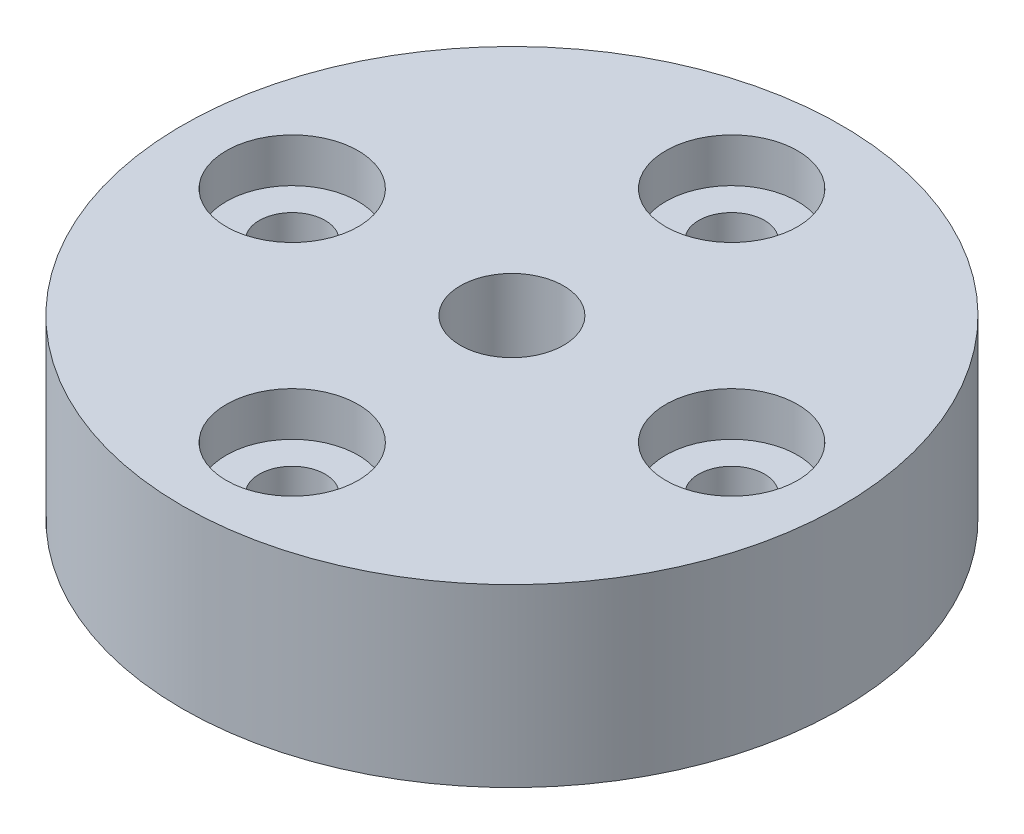
ISO-10303-21;
HEADER;
FILE_DESCRIPTION(('STEP AP214'),'2;1');
FILE_NAME('part.step','',(''),(''),'','','');
FILE_SCHEMA(('AUTOMOTIVE_DESIGN { 1 0 10303 214 1 1 1 1 }'));
ENDSEC;
DATA;
#1=APPLICATION_CONTEXT('core data for automotive mechanical design processes');
#2=APPLICATION_PROTOCOL_DEFINITION('international standard','automotive_design',2000,#1);
#3=PRODUCT_CONTEXT('',#1,'mechanical');
#4=PRODUCT('Part','Part','',(#3));
#5=PRODUCT_RELATED_PRODUCT_CATEGORY('part','',(#4));
#6=PRODUCT_DEFINITION_FORMATION('','',#4);
#7=PRODUCT_DEFINITION_CONTEXT('part definition',#1,'design');
#8=PRODUCT_DEFINITION('design','',#6,#7);
#9=PRODUCT_DEFINITION_SHAPE('','',#8);
#10=(LENGTH_UNIT() NAMED_UNIT(*) SI_UNIT(.MILLI.,.METRE.));
#11=(NAMED_UNIT(*) PLANE_ANGLE_UNIT() SI_UNIT($,.RADIAN.));
#12=(NAMED_UNIT(*) SI_UNIT($,.STERADIAN.) SOLID_ANGLE_UNIT());
#13=UNCERTAINTY_MEASURE_WITH_UNIT(LENGTH_MEASURE(1.E-05),#10,'distance_accuracy_value','');
#14=(GEOMETRIC_REPRESENTATION_CONTEXT(3) GLOBAL_UNCERTAINTY_ASSIGNED_CONTEXT((#13)) GLOBAL_UNIT_ASSIGNED_CONTEXT((#10,
#11,#12)) REPRESENTATION_CONTEXT('',''));
#15=CARTESIAN_POINT('',(0.,0.,0.));
#16=DIRECTION('',(0.,0.,1.));
#17=DIRECTION('',(1.,0.,0.));
#18=AXIS2_PLACEMENT_3D('',#15,#16,#17);
#19=CARTESIAN_POINT('',(5.64760248210638E-13,8.,10.));
#20=DIRECTION('',(0.,-1.,0.));
#21=DIRECTION('',(0.,0.,-1.));
#22=AXIS2_PLACEMENT_3D('',#19,#20,#21);
#23=CYLINDRICAL_SURFACE('',#22,1.50000000000061);
#24=CARTESIAN_POINT('',(5.64760248210638E-13,6.,10.));
#25=DIRECTION('',(0.,1.,0.));
#26=DIRECTION('',(0.,0.,1.));
#27=AXIS2_PLACEMENT_3D('',#24,#25,#26);
#28=CIRCLE('',#27,1.50000000000061);
#29=CARTESIAN_POINT('',(5.64760248210638E-13,6.,11.5000000000006));
#30=VERTEX_POINT('',#29);
#31=EDGE_CURVE('E186',#30,#30,#28,.F.);
#32=ORIENTED_EDGE('',*,*,#31,.F.);
#33=EDGE_LOOP('',(#32));
#34=FACE_BOUND('',#33,.T.);
#35=CARTESIAN_POINT('',(5.64760248210638E-13,2.,10.));
#36=DIRECTION('',(0.,-1.,0.));
#37=DIRECTION('',(0.,0.,-1.));
#38=AXIS2_PLACEMENT_3D('',#35,#36,#37);
#39=CIRCLE('',#38,1.50000000000061);
#40=CARTESIAN_POINT('',(5.64760248210638E-13,2.,8.49999999999939));
#41=VERTEX_POINT('',#40);
#42=EDGE_CURVE('E45',#41,#41,#39,.T.);
#43=ORIENTED_EDGE('',*,*,#42,.T.);
#44=EDGE_LOOP('',(#43));
#45=FACE_BOUND('',#44,.T.);
#46=ADVANCED_FACE('F41',(#34,#45),#23,.F.);
#47=CARTESIAN_POINT('',(10.0000000000003,8.,-2.82380124105319E-13));
#48=DIRECTION('',(0.,-1.,0.));
#49=DIRECTION('',(0.,0.,-1.));
#50=AXIS2_PLACEMENT_3D('',#47,#48,#49);
#51=CYLINDRICAL_SURFACE('',#50,1.50000000000022);
#52=CARTESIAN_POINT('',(10.0000000000003,6.,-2.82380124105319E-13));
#53=DIRECTION('',(0.,1.,0.));
#54=DIRECTION('',(0.,0.,1.));
#55=AXIS2_PLACEMENT_3D('',#52,#53,#54);
#56=CIRCLE('',#55,1.50000000000022);
#57=CARTESIAN_POINT('',(10.0000000000003,6.,1.49999999999994));
#58=VERTEX_POINT('',#57);
#59=EDGE_CURVE('E198',#58,#58,#56,.F.);
#60=ORIENTED_EDGE('',*,*,#59,.F.);
#61=EDGE_LOOP('',(#60));
#62=FACE_BOUND('',#61,.T.);
#63=CARTESIAN_POINT('',(10.0000000000003,2.,-2.82380124105319E-13));
#64=DIRECTION('',(0.,-1.,0.));
#65=DIRECTION('',(0.,0.,-1.));
#66=AXIS2_PLACEMENT_3D('',#63,#64,#65);
#67=CIRCLE('',#66,1.50000000000022);
#68=CARTESIAN_POINT('',(10.0000000000003,2.,-1.5000000000005));
#69=VERTEX_POINT('',#68);
#70=EDGE_CURVE('E75',#69,#69,#67,.T.);
#71=ORIENTED_EDGE('',*,*,#70,.T.);
#72=EDGE_LOOP('',(#71));
#73=FACE_BOUND('',#72,.T.);
#74=ADVANCED_FACE('F124',(#62,#73),#51,.F.);
#75=CARTESIAN_POINT('',(0.,8.,-10.));
#76=DIRECTION('',(0.,-1.,0.));
#77=DIRECTION('',(0.,0.,-1.));
#78=AXIS2_PLACEMENT_3D('',#75,#76,#77);
#79=CYLINDRICAL_SURFACE('',#78,1.5);
#80=CARTESIAN_POINT('',(0.,6.,-10.));
#81=DIRECTION('',(0.,1.,0.));
#82=DIRECTION('',(0.,0.,1.));
#83=AXIS2_PLACEMENT_3D('',#80,#81,#82);
#84=CIRCLE('',#83,1.5);
#85=CARTESIAN_POINT('',(0.,6.,-8.5));
#86=VERTEX_POINT('',#85);
#87=EDGE_CURVE('E62',#86,#86,#84,.T.);
#88=ORIENTED_EDGE('',*,*,#87,.T.);
#89=EDGE_LOOP('',(#88));
#90=FACE_BOUND('',#89,.T.);
#91=CARTESIAN_POINT('',(0.,2.,-10.));
#92=DIRECTION('',(0.,-1.,0.));
#93=DIRECTION('',(0.,0.,-1.));
#94=AXIS2_PLACEMENT_3D('',#91,#92,#93);
#95=CIRCLE('',#94,1.5);
#96=CARTESIAN_POINT('',(0.,2.,-11.5));
#97=VERTEX_POINT('',#96);
#98=EDGE_CURVE('E71',#97,#97,#95,.T.);
#99=ORIENTED_EDGE('',*,*,#98,.T.);
#100=EDGE_LOOP('',(#99));
#101=FACE_BOUND('',#100,.T.);
#102=ADVANCED_FACE('F130',(#90,#101),#79,.F.);
#103=CARTESIAN_POINT('',(-9.99999999999972,8.,2.83604770904466E-13));
#104=DIRECTION('',(0.,-1.,0.));
#105=DIRECTION('',(0.,0.,-1.));
#106=AXIS2_PLACEMENT_3D('',#103,#104,#105);
#107=CYLINDRICAL_SURFACE('',#106,1.50000000000045);
#108=CARTESIAN_POINT('',(-9.99999999999972,6.,2.83604770904466E-13));
#109=DIRECTION('',(0.,1.,0.));
#110=DIRECTION('',(0.,0.,1.));
#111=AXIS2_PLACEMENT_3D('',#108,#109,#110);
#112=CIRCLE('',#111,1.50000000000045);
#113=CARTESIAN_POINT('',(-9.99999999999972,6.,1.50000000000074));
#114=VERTEX_POINT('',#113);
#115=EDGE_CURVE('E171',#114,#114,#112,.F.);
#116=ORIENTED_EDGE('',*,*,#115,.F.);
#117=EDGE_LOOP('',(#116));
#118=FACE_BOUND('',#117,.T.);
#119=CARTESIAN_POINT('',(-9.99999999999972,2.,2.83604770904466E-13));
#120=DIRECTION('',(0.,-1.,0.));
#121=DIRECTION('',(0.,0.,-1.));
#122=AXIS2_PLACEMENT_3D('',#119,#120,#121);
#123=CIRCLE('',#122,1.50000000000045);
#124=CARTESIAN_POINT('',(-9.99999999999972,2.,-1.50000000000017));
#125=VERTEX_POINT('',#124);
#126=EDGE_CURVE('E67',#125,#125,#123,.T.);
#127=ORIENTED_EDGE('',*,*,#126,.T.);
#128=EDGE_LOOP('',(#127));
#129=FACE_BOUND('',#128,.T.);
#130=ADVANCED_FACE('F43',(#118,#129),#107,.F.);
#131=CARTESIAN_POINT('',(0.,8.,0.));
#132=DIRECTION('',(0.,-1.,0.));
#133=DIRECTION('',(0.,0.,-1.));
#134=AXIS2_PLACEMENT_3D('',#131,#132,#133);
#135=CYLINDRICAL_SURFACE('',#134,15.);
#136=CARTESIAN_POINT('',(0.,8.,0.));
#137=DIRECTION('',(0.,1.,0.));
#138=DIRECTION('',(0.,0.,1.));
#139=AXIS2_PLACEMENT_3D('',#136,#137,#138);
#140=CIRCLE('',#139,15.);
#141=CARTESIAN_POINT('',(0.,8.,15.));
#142=VERTEX_POINT('',#141);
#143=EDGE_CURVE('E10',#142,#142,#140,.T.);
#144=ORIENTED_EDGE('',*,*,#143,.F.);
#145=EDGE_LOOP('',(#144));
#146=FACE_BOUND('',#145,.T.);
#147=CARTESIAN_POINT('',(0.,0.,0.));
#148=DIRECTION('',(0.,1.,0.));
#149=DIRECTION('',(0.,0.,1.));
#150=AXIS2_PLACEMENT_3D('',#147,#148,#149);
#151=CIRCLE('',#150,15.);
#152=CARTESIAN_POINT('',(0.,0.,15.));
#153=VERTEX_POINT('',#152);
#154=EDGE_CURVE('E50',#153,#153,#151,.T.);
#155=ORIENTED_EDGE('',*,*,#154,.T.);
#156=EDGE_LOOP('',(#155));
#157=FACE_BOUND('',#156,.T.);
#158=ADVANCED_FACE('F109',(#146,#157),#135,.T.);
#159=CARTESIAN_POINT('',(0.,8.,0.));
#160=DIRECTION('',(0.,1.,0.));
#161=DIRECTION('',(0.,0.,1.));
#162=AXIS2_PLACEMENT_3D('',#159,#160,#161);
#163=PLANE('',#162);
#164=CARTESIAN_POINT('',(-9.99999999999972,8.,2.83604770904466E-13));
#165=DIRECTION('',(0.,1.,0.));
#166=DIRECTION('',(0.,0.,1.));
#167=AXIS2_PLACEMENT_3D('',#164,#165,#166);
#168=CIRCLE('',#167,3.00000000000045);
#169=CARTESIAN_POINT('',(-9.99999999999972,8.,3.00000000000074));
#170=VERTEX_POINT('',#169);
#171=EDGE_CURVE('E175',#170,#170,#168,.T.);
#172=ORIENTED_EDGE('',*,*,#171,.F.);
#173=EDGE_LOOP('',(#172));
#174=FACE_BOUND('',#173,.T.);
#175=CARTESIAN_POINT('',(5.64760248210638E-13,8.,10.));
#176=DIRECTION('',(0.,1.,0.));
#177=DIRECTION('',(0.,0.,1.));
#178=AXIS2_PLACEMENT_3D('',#175,#176,#177);
#179=CIRCLE('',#178,3.00000000000061);
#180=CARTESIAN_POINT('',(5.64760248210638E-13,8.,13.0000000000006));
#181=VERTEX_POINT('',#180);
#182=EDGE_CURVE('E182',#181,#181,#179,.T.);
#183=ORIENTED_EDGE('',*,*,#182,.F.);
#184=EDGE_LOOP('',(#183));
#185=FACE_BOUND('',#184,.T.);
#186=CARTESIAN_POINT('',(10.0000000000003,8.,-2.82380124105319E-13));
#187=DIRECTION('',(0.,1.,0.));
#188=DIRECTION('',(0.,0.,1.));
#189=AXIS2_PLACEMENT_3D('',#186,#187,#188);
#190=CIRCLE('',#189,3.00000000000022);
#191=CARTESIAN_POINT('',(10.0000000000003,8.,2.99999999999994));
#192=VERTEX_POINT('',#191);
#193=EDGE_CURVE('E191',#192,#192,#190,.T.);
#194=ORIENTED_EDGE('',*,*,#193,.F.);
#195=EDGE_LOOP('',(#194));
#196=FACE_BOUND('',#195,.T.);
#197=CARTESIAN_POINT('',(0.,8.,-10.));
#198=DIRECTION('',(0.,1.,0.));
#199=DIRECTION('',(0.,0.,1.));
#200=AXIS2_PLACEMENT_3D('',#197,#198,#199);
#201=CIRCLE('',#200,3.);
#202=CARTESIAN_POINT('',(0.,8.,-7.));
#203=VERTEX_POINT('',#202);
#204=EDGE_CURVE('E87',#203,#203,#201,.T.);
#205=ORIENTED_EDGE('',*,*,#204,.F.);
#206=EDGE_LOOP('',(#205));
#207=FACE_BOUND('',#206,.T.);
#208=CARTESIAN_POINT('',(0.,8.,0.));
#209=DIRECTION('',(0.,1.,0.));
#210=DIRECTION('',(0.,0.,1.));
#211=AXIS2_PLACEMENT_3D('',#208,#209,#210);
#212=CIRCLE('',#211,2.35);
#213=CARTESIAN_POINT('',(0.,8.,2.35));
#214=VERTEX_POINT('',#213);
#215=EDGE_CURVE('E59',#214,#214,#212,.T.);
#216=ORIENTED_EDGE('',*,*,#215,.F.);
#217=EDGE_LOOP('',(#216));
#218=FACE_BOUND('',#217,.T.);
#219=ORIENTED_EDGE('',*,*,#143,.T.);
#220=EDGE_LOOP('',(#219));
#221=FACE_BOUND('',#220,.T.);
#222=ADVANCED_FACE('F106',(#174,#185,#196,#207,#218,#221),#163,.T.);
#223=CARTESIAN_POINT('',(0.,0.,0.));
#224=DIRECTION('',(0.,1.,0.));
#225=DIRECTION('',(0.,0.,1.));
#226=AXIS2_PLACEMENT_3D('',#223,#224,#225);
#227=PLANE('',#226);
#228=CARTESIAN_POINT('',(5.64760248210638E-13,0.,10.));
#229=DIRECTION('',(0.,-1.,0.));
#230=DIRECTION('',(0.,0.,-1.));
#231=AXIS2_PLACEMENT_3D('',#228,#229,#230);
#232=CIRCLE('',#231,3.);
#233=CARTESIAN_POINT('',(5.64760248210638E-13,0.,7.));
#234=VERTEX_POINT('',#233);
#235=EDGE_CURVE('E279',#234,#234,#232,.T.);
#236=ORIENTED_EDGE('',*,*,#235,.F.);
#237=EDGE_LOOP('',(#236));
#238=FACE_BOUND('',#237,.T.);
#239=CARTESIAN_POINT('',(10.0000000000003,0.,-2.86054064502761E-13));
#240=DIRECTION('',(0.,-1.,0.));
#241=DIRECTION('',(0.,0.,-1.));
#242=AXIS2_PLACEMENT_3D('',#239,#240,#241);
#243=CIRCLE('',#242,3.00000000000022);
#244=CARTESIAN_POINT('',(10.0000000000003,0.,-3.0000000000005));
#245=VERTEX_POINT('',#244);
#246=EDGE_CURVE('E283',#245,#245,#243,.T.);
#247=ORIENTED_EDGE('',*,*,#246,.F.);
#248=EDGE_LOOP('',(#247));
#249=FACE_BOUND('',#248,.T.);
#250=CARTESIAN_POINT('',(0.,0.,-10.));
#251=DIRECTION('',(0.,-1.,0.));
#252=DIRECTION('',(0.,0.,-1.));
#253=AXIS2_PLACEMENT_3D('',#250,#251,#252);
#254=CIRCLE('',#253,3.0000000000006);
#255=CARTESIAN_POINT('',(0.,0.,-13.0000000000006));
#256=VERTEX_POINT('',#255);
#257=EDGE_CURVE('E155',#256,#256,#254,.T.);
#258=ORIENTED_EDGE('',*,*,#257,.F.);
#259=EDGE_LOOP('',(#258));
#260=FACE_BOUND('',#259,.T.);
#261=CARTESIAN_POINT('',(-9.99999999999972,0.,2.84829417703614E-13));
#262=DIRECTION('',(0.,-1.,0.));
#263=DIRECTION('',(0.,0.,-1.));
#264=AXIS2_PLACEMENT_3D('',#261,#262,#263);
#265=CIRCLE('',#264,3.00000000000045);
#266=CARTESIAN_POINT('',(-9.99999999999972,0.,-3.00000000000016));
#267=VERTEX_POINT('',#266);
#268=EDGE_CURVE('E156',#267,#267,#265,.T.);
#269=ORIENTED_EDGE('',*,*,#268,.F.);
#270=EDGE_LOOP('',(#269));
#271=FACE_BOUND('',#270,.T.);
#272=CARTESIAN_POINT('',(0.,0.,0.));
#273=DIRECTION('',(0.,1.,0.));
#274=DIRECTION('',(0.,0.,1.));
#275=AXIS2_PLACEMENT_3D('',#272,#273,#274);
#276=CIRCLE('',#275,2.35);
#277=CARTESIAN_POINT('',(0.,0.,2.35));
#278=VERTEX_POINT('',#277);
#279=EDGE_CURVE('E56',#278,#278,#276,.T.);
#280=ORIENTED_EDGE('',*,*,#279,.T.);
#281=EDGE_LOOP('',(#280));
#282=FACE_BOUND('',#281,.T.);
#283=ORIENTED_EDGE('',*,*,#154,.F.);
#284=EDGE_LOOP('',(#283));
#285=FACE_BOUND('',#284,.T.);
#286=ADVANCED_FACE('F108',(#238,#249,#260,#271,#282,#285),#227,.F.);
#287=CARTESIAN_POINT('',(0.,0.,0.));
#288=DIRECTION('',(0.,1.,0.));
#289=DIRECTION('',(0.,0.,1.));
#290=AXIS2_PLACEMENT_3D('',#287,#288,#289);
#291=CYLINDRICAL_SURFACE('',#290,2.35);
#292=ORIENTED_EDGE('',*,*,#279,.F.);
#293=EDGE_LOOP('',(#292));
#294=FACE_BOUND('',#293,.T.);
#295=ORIENTED_EDGE('',*,*,#215,.T.);
#296=EDGE_LOOP('',(#295));
#297=FACE_BOUND('',#296,.T.);
#298=ADVANCED_FACE('F104',(#294,#297),#291,.F.);
#299=CARTESIAN_POINT('',(0.,6.,-10.));
#300=DIRECTION('',(0.,1.,0.));
#301=DIRECTION('',(0.,0.,1.));
#302=AXIS2_PLACEMENT_3D('',#299,#300,#301);
#303=CYLINDRICAL_SURFACE('',#302,3.);
#304=CARTESIAN_POINT('',(0.,6.,-10.));
#305=DIRECTION('',(0.,1.,0.));
#306=DIRECTION('',(0.,0.,1.));
#307=AXIS2_PLACEMENT_3D('',#304,#305,#306);
#308=CIRCLE('',#307,3.);
#309=CARTESIAN_POINT('',(0.,6.,-7.));
#310=VERTEX_POINT('',#309);
#311=EDGE_CURVE('E82',#310,#310,#308,.T.);
#312=ORIENTED_EDGE('',*,*,#311,.F.);
#313=EDGE_LOOP('',(#312));
#314=FACE_BOUND('',#313,.T.);
#315=ORIENTED_EDGE('',*,*,#204,.T.);
#316=EDGE_LOOP('',(#315));
#317=FACE_BOUND('',#316,.T.);
#318=ADVANCED_FACE('F222',(#314,#317),#303,.F.);
#319=CARTESIAN_POINT('',(0.,6.,-10.));
#320=DIRECTION('',(0.,1.,0.));
#321=DIRECTION('',(0.,0.,1.));
#322=AXIS2_PLACEMENT_3D('',#319,#320,#321);
#323=PLANE('',#322);
#324=ORIENTED_EDGE('',*,*,#87,.F.);
#325=EDGE_LOOP('',(#324));
#326=FACE_BOUND('',#325,.T.);
#327=ORIENTED_EDGE('',*,*,#311,.T.);
#328=EDGE_LOOP('',(#327));
#329=FACE_BOUND('',#328,.T.);
#330=ADVANCED_FACE('F215',(#326,#329),#323,.T.);
#331=CARTESIAN_POINT('',(10.0000000000003,6.,-2.82380124105319E-13));
#332=DIRECTION('',(0.,1.,0.));
#333=DIRECTION('',(0.,0.,1.));
#334=AXIS2_PLACEMENT_3D('',#331,#332,#333);
#335=CYLINDRICAL_SURFACE('',#334,3.00000000000022);
#336=CARTESIAN_POINT('',(10.0000000000003,6.,-2.82380124105319E-13));
#337=DIRECTION('',(0.,1.,0.));
#338=DIRECTION('',(0.,0.,1.));
#339=AXIS2_PLACEMENT_3D('',#336,#337,#338);
#340=CIRCLE('',#339,3.00000000000022);
#341=CARTESIAN_POINT('',(10.0000000000003,6.,2.99999999999994));
#342=VERTEX_POINT('',#341);
#343=EDGE_CURVE('E93',#342,#342,#340,.T.);
#344=ORIENTED_EDGE('',*,*,#343,.F.);
#345=EDGE_LOOP('',(#344));
#346=FACE_BOUND('',#345,.T.);
#347=ORIENTED_EDGE('',*,*,#193,.T.);
#348=EDGE_LOOP('',(#347));
#349=FACE_BOUND('',#348,.T.);
#350=ADVANCED_FACE('F209',(#346,#349),#335,.F.);
#351=CARTESIAN_POINT('',(0.,6.,0.));
#352=DIRECTION('',(0.,1.,0.));
#353=DIRECTION('',(0.,0.,1.));
#354=AXIS2_PLACEMENT_3D('',#351,#352,#353);
#355=PLANE('',#354);
#356=ORIENTED_EDGE('',*,*,#59,.T.);
#357=EDGE_LOOP('',(#356));
#358=FACE_BOUND('',#357,.T.);
#359=ORIENTED_EDGE('',*,*,#343,.T.);
#360=EDGE_LOOP('',(#359));
#361=FACE_BOUND('',#360,.T.);
#362=ADVANCED_FACE('F205',(#358,#361),#355,.T.);
#363=CARTESIAN_POINT('',(5.64760248210638E-13,6.,10.));
#364=DIRECTION('',(0.,1.,0.));
#365=DIRECTION('',(0.,0.,1.));
#366=AXIS2_PLACEMENT_3D('',#363,#364,#365);
#367=CYLINDRICAL_SURFACE('',#366,3.00000000000061);
#368=CARTESIAN_POINT('',(5.64760248210638E-13,6.,10.));
#369=DIRECTION('',(0.,1.,0.));
#370=DIRECTION('',(0.,0.,1.));
#371=AXIS2_PLACEMENT_3D('',#368,#369,#370);
#372=CIRCLE('',#371,3.00000000000061);
#373=CARTESIAN_POINT('',(5.64760248210638E-13,6.,13.0000000000006));
#374=VERTEX_POINT('',#373);
#375=EDGE_CURVE('E187',#374,#374,#372,.T.);
#376=ORIENTED_EDGE('',*,*,#375,.F.);
#377=EDGE_LOOP('',(#376));
#378=FACE_BOUND('',#377,.T.);
#379=ORIENTED_EDGE('',*,*,#182,.T.);
#380=EDGE_LOOP('',(#379));
#381=FACE_BOUND('',#380,.T.);
#382=ADVANCED_FACE('F208',(#378,#381),#367,.F.);
#383=CARTESIAN_POINT('',(0.,6.,0.));
#384=DIRECTION('',(0.,1.,0.));
#385=DIRECTION('',(0.,0.,1.));
#386=AXIS2_PLACEMENT_3D('',#383,#384,#385);
#387=PLANE('',#386);
#388=ORIENTED_EDGE('',*,*,#31,.T.);
#389=EDGE_LOOP('',(#388));
#390=FACE_BOUND('',#389,.T.);
#391=ORIENTED_EDGE('',*,*,#375,.T.);
#392=EDGE_LOOP('',(#391));
#393=FACE_BOUND('',#392,.T.);
#394=ADVANCED_FACE('F234',(#390,#393),#387,.T.);
#395=CARTESIAN_POINT('',(-9.99999999999972,6.,2.83604770904466E-13));
#396=DIRECTION('',(0.,1.,0.));
#397=DIRECTION('',(0.,0.,1.));
#398=AXIS2_PLACEMENT_3D('',#395,#396,#397);
#399=CYLINDRICAL_SURFACE('',#398,3.00000000000045);
#400=CARTESIAN_POINT('',(-9.99999999999972,6.,2.83604770904466E-13));
#401=DIRECTION('',(0.,1.,0.));
#402=DIRECTION('',(0.,0.,1.));
#403=AXIS2_PLACEMENT_3D('',#400,#401,#402);
#404=CIRCLE('',#403,3.00000000000045);
#405=CARTESIAN_POINT('',(-9.99999999999972,6.,3.00000000000074));
#406=VERTEX_POINT('',#405);
#407=EDGE_CURVE('E66',#406,#406,#404,.T.);
#408=ORIENTED_EDGE('',*,*,#407,.F.);
#409=EDGE_LOOP('',(#408));
#410=FACE_BOUND('',#409,.T.);
#411=ORIENTED_EDGE('',*,*,#171,.T.);
#412=EDGE_LOOP('',(#411));
#413=FACE_BOUND('',#412,.T.);
#414=ADVANCED_FACE('F237',(#410,#413),#399,.F.);
#415=CARTESIAN_POINT('',(0.,6.,0.));
#416=DIRECTION('',(0.,1.,0.));
#417=DIRECTION('',(0.,0.,1.));
#418=AXIS2_PLACEMENT_3D('',#415,#416,#417);
#419=PLANE('',#418);
#420=ORIENTED_EDGE('',*,*,#115,.T.);
#421=EDGE_LOOP('',(#420));
#422=FACE_BOUND('',#421,.T.);
#423=ORIENTED_EDGE('',*,*,#407,.T.);
#424=EDGE_LOOP('',(#423));
#425=FACE_BOUND('',#424,.T.);
#426=ADVANCED_FACE('F244',(#422,#425),#419,.T.);
#427=CARTESIAN_POINT('',(-9.99999999999972,2.,2.84829417703614E-13));
#428=DIRECTION('',(0.,-1.,0.));
#429=DIRECTION('',(0.,0.,-1.));
#430=AXIS2_PLACEMENT_3D('',#427,#428,#429);
#431=CYLINDRICAL_SURFACE('',#430,3.00000000000045);
#432=CARTESIAN_POINT('',(-9.99999999999972,2.,2.84829417703614E-13));
#433=DIRECTION('',(0.,-1.,0.));
#434=DIRECTION('',(0.,0.,-1.));
#435=AXIS2_PLACEMENT_3D('',#432,#433,#434);
#436=CIRCLE('',#435,3.00000000000045);
#437=CARTESIAN_POINT('',(-9.99999999999972,2.,-3.00000000000016));
#438=VERTEX_POINT('',#437);
#439=EDGE_CURVE('E164',#438,#438,#436,.T.);
#440=ORIENTED_EDGE('',*,*,#439,.F.);
#441=EDGE_LOOP('',(#440));
#442=FACE_BOUND('',#441,.T.);
#443=ORIENTED_EDGE('',*,*,#268,.T.);
#444=EDGE_LOOP('',(#443));
#445=FACE_BOUND('',#444,.T.);
#446=ADVANCED_FACE('F248',(#442,#445),#431,.F.);
#447=CARTESIAN_POINT('',(-9.99999999999972,2.,2.84829417703614E-13));
#448=DIRECTION('',(0.,-1.,0.));
#449=DIRECTION('',(0.,0.,-1.));
#450=AXIS2_PLACEMENT_3D('',#447,#448,#449);
#451=PLANE('',#450);
#452=ORIENTED_EDGE('',*,*,#126,.F.);
#453=EDGE_LOOP('',(#452));
#454=FACE_BOUND('',#453,.T.);
#455=ORIENTED_EDGE('',*,*,#439,.T.);
#456=EDGE_LOOP('',(#455));
#457=FACE_BOUND('',#456,.T.);
#458=ADVANCED_FACE('F250',(#454,#457),#451,.T.);
#459=CARTESIAN_POINT('',(0.,2.,-10.));
#460=DIRECTION('',(0.,-1.,0.));
#461=DIRECTION('',(0.,0.,-1.));
#462=AXIS2_PLACEMENT_3D('',#459,#460,#461);
#463=CYLINDRICAL_SURFACE('',#462,3.0000000000006);
#464=CARTESIAN_POINT('',(0.,2.,-10.));
#465=DIRECTION('',(0.,-1.,0.));
#466=DIRECTION('',(0.,0.,-1.));
#467=AXIS2_PLACEMENT_3D('',#464,#465,#466);
#468=CIRCLE('',#467,3.0000000000006);
#469=CARTESIAN_POINT('',(0.,2.,-13.0000000000006));
#470=VERTEX_POINT('',#469);
#471=EDGE_CURVE('E152',#470,#470,#468,.T.);
#472=ORIENTED_EDGE('',*,*,#471,.F.);
#473=EDGE_LOOP('',(#472));
#474=FACE_BOUND('',#473,.T.);
#475=ORIENTED_EDGE('',*,*,#257,.T.);
#476=EDGE_LOOP('',(#475));
#477=FACE_BOUND('',#476,.T.);
#478=ADVANCED_FACE('F148',(#474,#477),#463,.F.);
#479=CARTESIAN_POINT('',(0.,2.,-10.));
#480=DIRECTION('',(0.,-1.,0.));
#481=DIRECTION('',(0.,0.,-1.));
#482=AXIS2_PLACEMENT_3D('',#479,#480,#481);
#483=PLANE('',#482);
#484=ORIENTED_EDGE('',*,*,#98,.F.);
#485=EDGE_LOOP('',(#484));
#486=FACE_BOUND('',#485,.T.);
#487=ORIENTED_EDGE('',*,*,#471,.T.);
#488=EDGE_LOOP('',(#487));
#489=FACE_BOUND('',#488,.T.);
#490=ADVANCED_FACE('F144',(#486,#489),#483,.T.);
#491=CARTESIAN_POINT('',(10.0000000000003,2.,-2.86054064502761E-13));
#492=DIRECTION('',(0.,-1.,0.));
#493=DIRECTION('',(0.,0.,-1.));
#494=AXIS2_PLACEMENT_3D('',#491,#492,#493);
#495=CYLINDRICAL_SURFACE('',#494,3.00000000000022);
#496=CARTESIAN_POINT('',(10.0000000000003,2.,-2.86054064502761E-13));
#497=DIRECTION('',(0.,-1.,0.));
#498=DIRECTION('',(0.,0.,-1.));
#499=AXIS2_PLACEMENT_3D('',#496,#497,#498);
#500=CIRCLE('',#499,3.00000000000022);
#501=CARTESIAN_POINT('',(10.0000000000003,2.,-3.0000000000005));
#502=VERTEX_POINT('',#501);
#503=EDGE_CURVE('E161',#502,#502,#500,.T.);
#504=ORIENTED_EDGE('',*,*,#503,.F.);
#505=EDGE_LOOP('',(#504));
#506=FACE_BOUND('',#505,.T.);
#507=ORIENTED_EDGE('',*,*,#246,.T.);
#508=EDGE_LOOP('',(#507));
#509=FACE_BOUND('',#508,.T.);
#510=ADVANCED_FACE('F147',(#506,#509),#495,.F.);
#511=CARTESIAN_POINT('',(10.0000000000003,2.,-2.86054064502761E-13));
#512=DIRECTION('',(0.,-1.,0.));
#513=DIRECTION('',(0.,0.,-1.));
#514=AXIS2_PLACEMENT_3D('',#511,#512,#513);
#515=PLANE('',#514);
#516=ORIENTED_EDGE('',*,*,#70,.F.);
#517=EDGE_LOOP('',(#516));
#518=FACE_BOUND('',#517,.T.);
#519=ORIENTED_EDGE('',*,*,#503,.T.);
#520=EDGE_LOOP('',(#519));
#521=FACE_BOUND('',#520,.T.);
#522=ADVANCED_FACE('F259',(#518,#521),#515,.T.);
#523=CARTESIAN_POINT('',(5.64760248210638E-13,2.,10.));
#524=DIRECTION('',(0.,-1.,0.));
#525=DIRECTION('',(0.,0.,-1.));
#526=AXIS2_PLACEMENT_3D('',#523,#524,#525);
#527=CYLINDRICAL_SURFACE('',#526,3.);
#528=CARTESIAN_POINT('',(5.64760248210638E-13,2.,10.));
#529=DIRECTION('',(0.,-1.,0.));
#530=DIRECTION('',(0.,0.,-1.));
#531=AXIS2_PLACEMENT_3D('',#528,#529,#530);
#532=CIRCLE('',#531,3.);
#533=CARTESIAN_POINT('',(5.64760248210638E-13,2.,7.));
#534=VERTEX_POINT('',#533);
#535=EDGE_CURVE('E72',#534,#534,#532,.T.);
#536=ORIENTED_EDGE('',*,*,#535,.F.);
#537=EDGE_LOOP('',(#536));
#538=FACE_BOUND('',#537,.T.);
#539=ORIENTED_EDGE('',*,*,#235,.T.);
#540=EDGE_LOOP('',(#539));
#541=FACE_BOUND('',#540,.T.);
#542=ADVANCED_FACE('F262',(#538,#541),#527,.F.);
#543=CARTESIAN_POINT('',(5.64760248210638E-13,2.,10.));
#544=DIRECTION('',(0.,-1.,0.));
#545=DIRECTION('',(0.,0.,-1.));
#546=AXIS2_PLACEMENT_3D('',#543,#544,#545);
#547=PLANE('',#546);
#548=ORIENTED_EDGE('',*,*,#42,.F.);
#549=EDGE_LOOP('',(#548));
#550=FACE_BOUND('',#549,.T.);
#551=ORIENTED_EDGE('',*,*,#535,.T.);
#552=EDGE_LOOP('',(#551));
#553=FACE_BOUND('',#552,.T.);
#554=ADVANCED_FACE('F269',(#550,#553),#547,.T.);
#555=CLOSED_SHELL('',(#46,#74,#102,#130,#158,#222,#286,#298,#318,#330,#350,#362,#382,#394,#414,
#426,#446,#458,#478,#490,#510,#522,#542,#554));
#556=MANIFOLD_SOLID_BREP('B2',#555);
#557=ADVANCED_BREP_SHAPE_REPRESENTATION('',(#18,#556),#14);
#558=SHAPE_DEFINITION_REPRESENTATION(#9,#557);
ENDSEC;
END-ISO-10303-21;
